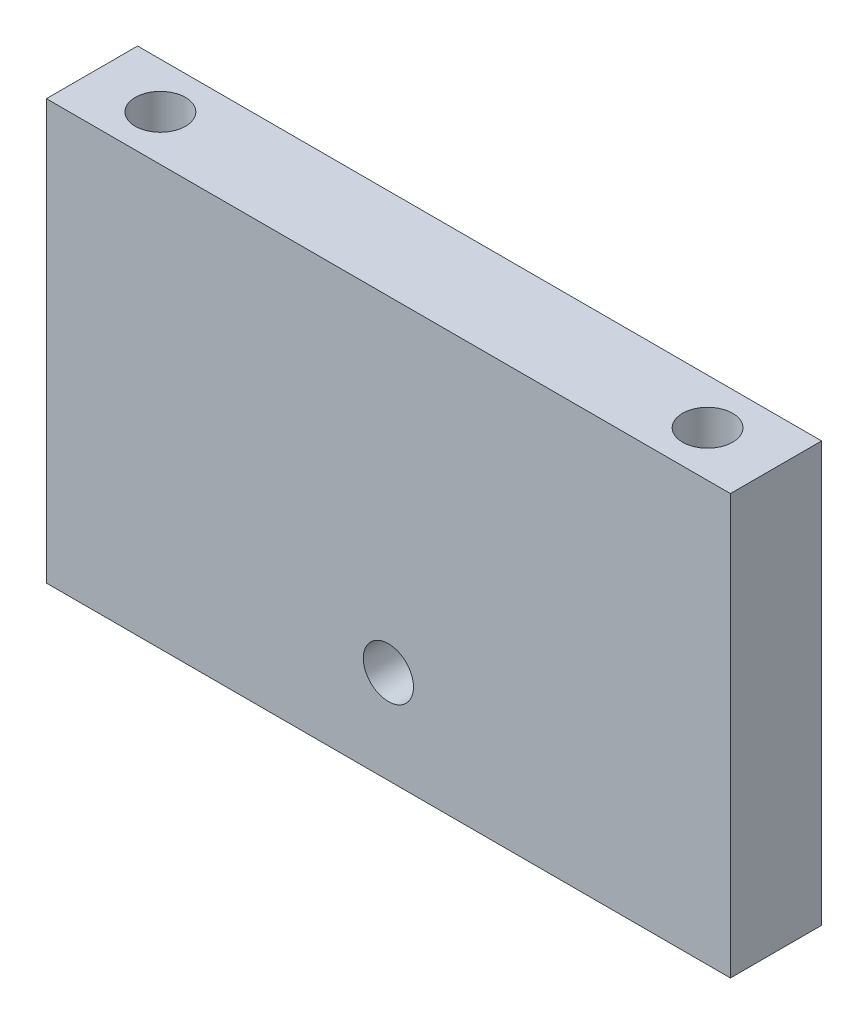
ISO-10303-21;
HEADER;
FILE_DESCRIPTION(('STEP AP214'),'2;1');
FILE_NAME('part.step','',(''),(''),'','','');
FILE_SCHEMA(('AUTOMOTIVE_DESIGN { 1 0 10303 214 1 1 1 1 }'));
ENDSEC;
DATA;
#1=APPLICATION_CONTEXT('core data for automotive mechanical design processes');
#2=APPLICATION_PROTOCOL_DEFINITION('international standard','automotive_design',2000,#1);
#3=PRODUCT_CONTEXT('',#1,'mechanical');
#4=PRODUCT('Part','Part','',(#3));
#5=PRODUCT_RELATED_PRODUCT_CATEGORY('part','',(#4));
#6=PRODUCT_DEFINITION_FORMATION('','',#4);
#7=PRODUCT_DEFINITION_CONTEXT('part definition',#1,'design');
#8=PRODUCT_DEFINITION('design','',#6,#7);
#9=PRODUCT_DEFINITION_SHAPE('','',#8);
#10=(LENGTH_UNIT() NAMED_UNIT(*) SI_UNIT(.MILLI.,.METRE.));
#11=(NAMED_UNIT(*) PLANE_ANGLE_UNIT() SI_UNIT($,.RADIAN.));
#12=(NAMED_UNIT(*) SI_UNIT($,.STERADIAN.) SOLID_ANGLE_UNIT());
#13=UNCERTAINTY_MEASURE_WITH_UNIT(LENGTH_MEASURE(1.E-05),#10,'distance_accuracy_value','');
#14=(GEOMETRIC_REPRESENTATION_CONTEXT(3) GLOBAL_UNCERTAINTY_ASSIGNED_CONTEXT((#13)) GLOBAL_UNIT_ASSIGNED_CONTEXT((#10,
#11,#12)) REPRESENTATION_CONTEXT('',''));
#15=CARTESIAN_POINT('',(0.,0.,0.));
#16=DIRECTION('',(0.,0.,1.));
#17=DIRECTION('',(1.,0.,0.));
#18=AXIS2_PLACEMENT_3D('',#15,#16,#17);
#19=CARTESIAN_POINT('',(0.,46.,0.));
#20=DIRECTION('',(0.,-1.,0.));
#21=DIRECTION('',(0.,0.,-1.));
#22=AXIS2_PLACEMENT_3D('',#19,#20,#21);
#23=PLANE('',#22);
#24=DIRECTION('',(0.,0.,1.));
#25=VECTOR('',#24,1.);
#26=CARTESIAN_POINT('',(0.,46.,0.));
#27=LINE('',#26,#25);
#28=CARTESIAN_POINT('',(0.,46.,-10.));
#29=VERTEX_POINT('',#28);
#30=CARTESIAN_POINT('',(0.,46.,0.));
#31=VERTEX_POINT('',#30);
#32=EDGE_CURVE('E99',#29,#31,#27,.T.);
#33=ORIENTED_EDGE('',*,*,#32,.T.);
#34=DIRECTION('',(1.,0.,0.));
#35=VECTOR('',#34,1.);
#36=CARTESIAN_POINT('',(0.,46.,0.));
#37=LINE('',#36,#35);
#38=CARTESIAN_POINT('',(75.,46.,0.));
#39=VERTEX_POINT('',#38);
#40=EDGE_CURVE('E94',#31,#39,#37,.T.);
#41=ORIENTED_EDGE('',*,*,#40,.T.);
#42=DIRECTION('',(0.,0.,-1.));
#43=VECTOR('',#42,1.);
#44=CARTESIAN_POINT('',(75.,46.,0.));
#45=LINE('',#44,#43);
#46=CARTESIAN_POINT('',(75.,46.,-10.));
#47=VERTEX_POINT('',#46);
#48=EDGE_CURVE('E97',#39,#47,#45,.T.);
#49=ORIENTED_EDGE('',*,*,#48,.T.);
#50=DIRECTION('',(-1.,0.,0.));
#51=VECTOR('',#50,1.);
#52=CARTESIAN_POINT('',(0.,46.,-10.));
#53=LINE('',#52,#51);
#54=EDGE_CURVE('E64',#47,#29,#53,.T.);
#55=ORIENTED_EDGE('',*,*,#54,.T.);
#56=EDGE_LOOP('',(#33,#41,#49,#55));
#57=FACE_BOUND('',#56,.T.);
#58=CARTESIAN_POINT('',(7.5,46.,-5.));
#59=DIRECTION('',(0.,1.,0.));
#60=DIRECTION('',(0.,0.,1.));
#61=AXIS2_PLACEMENT_3D('',#58,#59,#60);
#62=CIRCLE('',#61,2.75);
#63=CARTESIAN_POINT('',(7.5,46.,-2.25));
#64=VERTEX_POINT('',#63);
#65=EDGE_CURVE('E120',#64,#64,#62,.T.);
#66=ORIENTED_EDGE('',*,*,#65,.F.);
#67=EDGE_LOOP('',(#66));
#68=FACE_BOUND('',#67,.T.);
#69=CARTESIAN_POINT('',(67.5,46.,-5.));
#70=DIRECTION('',(0.,1.,0.));
#71=DIRECTION('',(0.,0.,-1.));
#72=AXIS2_PLACEMENT_3D('',#69,#70,#71);
#73=CIRCLE('',#72,2.75000000000001);
#74=CARTESIAN_POINT('',(67.5,46.,-7.75000000000001));
#75=VERTEX_POINT('',#74);
#76=EDGE_CURVE('E142',#75,#75,#73,.T.);
#77=ORIENTED_EDGE('',*,*,#76,.F.);
#78=EDGE_LOOP('',(#77));
#79=FACE_BOUND('',#78,.T.);
#80=ADVANCED_FACE('F45',(#57,#68,#79),#23,.F.);
#81=CARTESIAN_POINT('',(0.,0.,0.));
#82=DIRECTION('',(0.,-1.,0.));
#83=DIRECTION('',(0.,0.,-1.));
#84=AXIS2_PLACEMENT_3D('',#81,#82,#83);
#85=PLANE('',#84);
#86=CARTESIAN_POINT('',(7.5,0.,-5.));
#87=DIRECTION('',(0.,1.,0.));
#88=DIRECTION('',(0.,0.,1.));
#89=AXIS2_PLACEMENT_3D('',#86,#87,#88);
#90=CIRCLE('',#89,2.75);
#91=CARTESIAN_POINT('',(7.5,0.,-2.25));
#92=VERTEX_POINT('',#91);
#93=EDGE_CURVE('E138',#92,#92,#90,.T.);
#94=ORIENTED_EDGE('',*,*,#93,.T.);
#95=EDGE_LOOP('',(#94));
#96=FACE_BOUND('',#95,.T.);
#97=DIRECTION('',(0.,0.,1.));
#98=VECTOR('',#97,1.);
#99=CARTESIAN_POINT('',(0.,0.,0.));
#100=LINE('',#99,#98);
#101=CARTESIAN_POINT('',(0.,0.,-10.));
#102=VERTEX_POINT('',#101);
#103=CARTESIAN_POINT('',(0.,0.,0.));
#104=VERTEX_POINT('',#103);
#105=EDGE_CURVE('E116',#102,#104,#100,.T.);
#106=ORIENTED_EDGE('',*,*,#105,.F.);
#107=DIRECTION('',(-1.,0.,0.));
#108=VECTOR('',#107,1.);
#109=CARTESIAN_POINT('',(0.,0.,-10.));
#110=LINE('',#109,#108);
#111=CARTESIAN_POINT('',(75.,0.,-10.));
#112=VERTEX_POINT('',#111);
#113=EDGE_CURVE('E87',#112,#102,#110,.T.);
#114=ORIENTED_EDGE('',*,*,#113,.F.);
#115=DIRECTION('',(0.,0.,-1.));
#116=VECTOR('',#115,1.);
#117=CARTESIAN_POINT('',(75.,0.,0.));
#118=LINE('',#117,#116);
#119=CARTESIAN_POINT('',(75.,0.,0.));
#120=VERTEX_POINT('',#119);
#121=EDGE_CURVE('E81',#120,#112,#118,.T.);
#122=ORIENTED_EDGE('',*,*,#121,.F.);
#123=DIRECTION('',(1.,0.,0.));
#124=VECTOR('',#123,1.);
#125=CARTESIAN_POINT('',(0.,0.,0.));
#126=LINE('',#125,#124);
#127=EDGE_CURVE('E104',#104,#120,#126,.T.);
#128=ORIENTED_EDGE('',*,*,#127,.F.);
#129=EDGE_LOOP('',(#106,#114,#122,#128));
#130=FACE_BOUND('',#129,.T.);
#131=CARTESIAN_POINT('',(67.5,0.,-5.));
#132=DIRECTION('',(0.,1.,0.));
#133=DIRECTION('',(0.,0.,-1.));
#134=AXIS2_PLACEMENT_3D('',#131,#132,#133);
#135=CIRCLE('',#134,2.75000000000001);
#136=CARTESIAN_POINT('',(67.5,0.,-7.75000000000001));
#137=VERTEX_POINT('',#136);
#138=EDGE_CURVE('E146',#137,#137,#135,.T.);
#139=ORIENTED_EDGE('',*,*,#138,.T.);
#140=EDGE_LOOP('',(#139));
#141=FACE_BOUND('',#140,.T.);
#142=ADVANCED_FACE('F133',(#96,#130,#141),#85,.T.);
#143=CARTESIAN_POINT('',(0.,46.,0.));
#144=DIRECTION('',(1.,0.,0.));
#145=DIRECTION('',(0.,0.,-1.));
#146=AXIS2_PLACEMENT_3D('',#143,#144,#145);
#147=PLANE('',#146);
#148=ORIENTED_EDGE('',*,*,#105,.T.);
#149=DIRECTION('',(0.,-1.,0.));
#150=VECTOR('',#149,1.);
#151=CARTESIAN_POINT('',(0.,46.,0.));
#152=LINE('',#151,#150);
#153=EDGE_CURVE('E11',#31,#104,#152,.T.);
#154=ORIENTED_EDGE('',*,*,#153,.F.);
#155=ORIENTED_EDGE('',*,*,#32,.F.);
#156=DIRECTION('',(0.,-1.,0.));
#157=VECTOR('',#156,1.);
#158=CARTESIAN_POINT('',(0.,46.,-10.));
#159=LINE('',#158,#157);
#160=EDGE_CURVE('E112',#29,#102,#159,.T.);
#161=ORIENTED_EDGE('',*,*,#160,.T.);
#162=EDGE_LOOP('',(#148,#154,#155,#161));
#163=FACE_BOUND('',#162,.T.);
#164=ADVANCED_FACE('F47',(#163),#147,.F.);
#165=CARTESIAN_POINT('',(0.,46.,0.));
#166=DIRECTION('',(0.,0.,-1.));
#167=DIRECTION('',(-1.,0.,0.));
#168=AXIS2_PLACEMENT_3D('',#165,#166,#167);
#169=PLANE('',#168);
#170=CARTESIAN_POINT('',(37.5,10.25,0.));
#171=DIRECTION('',(0.,0.,1.));
#172=DIRECTION('',(1.,0.,0.));
#173=AXIS2_PLACEMENT_3D('',#170,#171,#172);
#174=CIRCLE('',#173,2.75);
#175=CARTESIAN_POINT('',(40.25,10.25,0.));
#176=VERTEX_POINT('',#175);
#177=EDGE_CURVE('E153',#176,#176,#174,.T.);
#178=ORIENTED_EDGE('',*,*,#177,.F.);
#179=EDGE_LOOP('',(#178));
#180=FACE_BOUND('',#179,.T.);
#181=ORIENTED_EDGE('',*,*,#127,.T.);
#182=DIRECTION('',(0.,-1.,0.));
#183=VECTOR('',#182,1.);
#184=CARTESIAN_POINT('',(75.,46.,0.));
#185=LINE('',#184,#183);
#186=EDGE_CURVE('E56',#39,#120,#185,.T.);
#187=ORIENTED_EDGE('',*,*,#186,.F.);
#188=ORIENTED_EDGE('',*,*,#40,.F.);
#189=ORIENTED_EDGE('',*,*,#153,.T.);
#190=EDGE_LOOP('',(#181,#187,#188,#189));
#191=FACE_BOUND('',#190,.T.);
#192=ADVANCED_FACE('F103',(#180,#191),#169,.F.);
#193=CARTESIAN_POINT('',(75.,46.,0.));
#194=DIRECTION('',(-1.,0.,0.));
#195=DIRECTION('',(0.,0.,1.));
#196=AXIS2_PLACEMENT_3D('',#193,#194,#195);
#197=PLANE('',#196);
#198=ORIENTED_EDGE('',*,*,#121,.T.);
#199=DIRECTION('',(0.,-1.,0.));
#200=VECTOR('',#199,1.);
#201=CARTESIAN_POINT('',(75.,46.,-10.));
#202=LINE('',#201,#200);
#203=EDGE_CURVE('E106',#47,#112,#202,.T.);
#204=ORIENTED_EDGE('',*,*,#203,.F.);
#205=ORIENTED_EDGE('',*,*,#48,.F.);
#206=ORIENTED_EDGE('',*,*,#186,.T.);
#207=EDGE_LOOP('',(#198,#204,#205,#206));
#208=FACE_BOUND('',#207,.T.);
#209=ADVANCED_FACE('F108',(#208),#197,.F.);
#210=CARTESIAN_POINT('',(0.,46.,-10.));
#211=DIRECTION('',(0.,0.,1.));
#212=DIRECTION('',(1.,0.,0.));
#213=AXIS2_PLACEMENT_3D('',#210,#211,#212);
#214=PLANE('',#213);
#215=CARTESIAN_POINT('',(37.5,10.25,-10.));
#216=DIRECTION('',(0.,0.,1.));
#217=DIRECTION('',(1.,0.,0.));
#218=AXIS2_PLACEMENT_3D('',#215,#216,#217);
#219=CIRCLE('',#218,2.75);
#220=CARTESIAN_POINT('',(40.25,10.25,-10.));
#221=VERTEX_POINT('',#220);
#222=EDGE_CURVE('E49',#221,#221,#219,.T.);
#223=ORIENTED_EDGE('',*,*,#222,.T.);
#224=EDGE_LOOP('',(#223));
#225=FACE_BOUND('',#224,.T.);
#226=ORIENTED_EDGE('',*,*,#113,.T.);
#227=ORIENTED_EDGE('',*,*,#160,.F.);
#228=ORIENTED_EDGE('',*,*,#54,.F.);
#229=ORIENTED_EDGE('',*,*,#203,.T.);
#230=EDGE_LOOP('',(#226,#227,#228,#229));
#231=FACE_BOUND('',#230,.T.);
#232=ADVANCED_FACE('F130',(#225,#231),#214,.F.);
#233=CARTESIAN_POINT('',(7.5,46.,-5.));
#234=DIRECTION('',(0.,-1.,0.));
#235=DIRECTION('',(0.,0.,-1.));
#236=AXIS2_PLACEMENT_3D('',#233,#234,#235);
#237=CYLINDRICAL_SURFACE('',#236,2.75);
#238=ORIENTED_EDGE('',*,*,#65,.T.);
#239=EDGE_LOOP('',(#238));
#240=FACE_BOUND('',#239,.T.);
#241=ORIENTED_EDGE('',*,*,#93,.F.);
#242=EDGE_LOOP('',(#241));
#243=FACE_BOUND('',#242,.T.);
#244=ADVANCED_FACE('F171',(#240,#243),#237,.F.);
#245=CARTESIAN_POINT('',(67.5,46.,-5.));
#246=DIRECTION('',(0.,-1.,0.));
#247=DIRECTION('',(0.,0.,-1.));
#248=AXIS2_PLACEMENT_3D('',#245,#246,#247);
#249=CYLINDRICAL_SURFACE('',#248,2.75000000000001);
#250=ORIENTED_EDGE('',*,*,#76,.T.);
#251=EDGE_LOOP('',(#250));
#252=FACE_BOUND('',#251,.T.);
#253=ORIENTED_EDGE('',*,*,#138,.F.);
#254=EDGE_LOOP('',(#253));
#255=FACE_BOUND('',#254,.T.);
#256=ADVANCED_FACE('F165',(#252,#255),#249,.F.);
#257=CARTESIAN_POINT('',(37.5,10.25,-45.));
#258=DIRECTION('',(0.,0.,1.));
#259=DIRECTION('',(1.,0.,0.));
#260=AXIS2_PLACEMENT_3D('',#257,#258,#259);
#261=CYLINDRICAL_SURFACE('',#260,2.75);
#262=CARTESIAN_POINT('',(40.25,10.25,0.));
#263=CARTESIAN_POINT('',(40.25,10.25,-0.104166666666674));
#264=CARTESIAN_POINT('',(40.25,10.25,-0.20833333333334));
#265=CARTESIAN_POINT('',(40.25,10.25,-0.416666666666674));
#266=CARTESIAN_POINT('',(40.25,10.25,-0.520833333333341));
#267=CARTESIAN_POINT('',(40.25,10.25,-0.729166666666674));
#268=CARTESIAN_POINT('',(40.25,10.25,-0.833333333333341));
#269=CARTESIAN_POINT('',(40.25,10.25,-1.04166666666667));
#270=CARTESIAN_POINT('',(40.25,10.25,-1.14583333333334));
#271=CARTESIAN_POINT('',(40.25,10.25,-1.35416666666667));
#272=CARTESIAN_POINT('',(40.25,10.25,-1.45833333333334));
#273=CARTESIAN_POINT('',(40.25,10.25,-1.66666666666667));
#274=CARTESIAN_POINT('',(40.25,10.25,-1.77083333333334));
#275=CARTESIAN_POINT('',(40.25,10.25,-1.97916666666668));
#276=CARTESIAN_POINT('',(40.25,10.25,-2.08333333333334));
#277=CARTESIAN_POINT('',(40.25,10.25,-2.29166666666668));
#278=CARTESIAN_POINT('',(40.25,10.25,-2.39583333333334));
#279=CARTESIAN_POINT('',(40.25,10.25,-2.60416666666667));
#280=CARTESIAN_POINT('',(40.25,10.25,-2.70833333333334));
#281=CARTESIAN_POINT('',(40.25,10.25,-2.91666666666667));
#282=CARTESIAN_POINT('',(40.25,10.25,-3.02083333333334));
#283=CARTESIAN_POINT('',(40.25,10.25,-3.22916666666667));
#284=CARTESIAN_POINT('',(40.25,10.25,-3.33333333333334));
#285=CARTESIAN_POINT('',(40.25,10.25,-3.54166666666667));
#286=CARTESIAN_POINT('',(40.25,10.25,-3.64583333333334));
#287=CARTESIAN_POINT('',(40.25,10.25,-3.85416666666667));
#288=CARTESIAN_POINT('',(40.25,10.25,-3.95833333333334));
#289=CARTESIAN_POINT('',(40.25,10.25,-4.16666666666667));
#290=CARTESIAN_POINT('',(40.25,10.25,-4.27083333333334));
#291=CARTESIAN_POINT('',(40.25,10.25,-4.47916666666667));
#292=CARTESIAN_POINT('',(40.25,10.25,-4.58333333333334));
#293=CARTESIAN_POINT('',(40.25,10.25,-4.79166666666667));
#294=CARTESIAN_POINT('',(40.25,10.25,-4.89583333333334));
#295=CARTESIAN_POINT('',(40.25,10.25,-5.10416666666667));
#296=CARTESIAN_POINT('',(40.25,10.25,-5.20833333333334));
#297=CARTESIAN_POINT('',(40.25,10.25,-5.41666666666667));
#298=CARTESIAN_POINT('',(40.25,10.25,-5.52083333333334));
#299=CARTESIAN_POINT('',(40.25,10.25,-5.72916666666667));
#300=CARTESIAN_POINT('',(40.25,10.25,-5.83333333333334));
#301=CARTESIAN_POINT('',(40.25,10.25,-6.04166666666667));
#302=CARTESIAN_POINT('',(40.25,10.25,-6.14583333333334));
#303=CARTESIAN_POINT('',(40.25,10.25,-6.35416666666667));
#304=CARTESIAN_POINT('',(40.25,10.25,-6.45833333333334));
#305=CARTESIAN_POINT('',(40.25,10.25,-6.66666666666667));
#306=CARTESIAN_POINT('',(40.25,10.25,-6.77083333333334));
#307=CARTESIAN_POINT('',(40.25,10.25,-6.97916666666667));
#308=CARTESIAN_POINT('',(40.25,10.25,-7.08333333333334));
#309=CARTESIAN_POINT('',(40.25,10.25,-7.29166666666667));
#310=CARTESIAN_POINT('',(40.25,10.25,-7.39583333333333));
#311=CARTESIAN_POINT('',(40.25,10.25,-7.60416666666667));
#312=CARTESIAN_POINT('',(40.25,10.25,-7.70833333333334));
#313=CARTESIAN_POINT('',(40.25,10.25,-7.91666666666667));
#314=CARTESIAN_POINT('',(40.25,10.25,-8.02083333333334));
#315=CARTESIAN_POINT('',(40.25,10.25,-8.22916666666667));
#316=CARTESIAN_POINT('',(40.25,10.25,-8.33333333333333));
#317=CARTESIAN_POINT('',(40.25,10.25,-8.54166666666667));
#318=CARTESIAN_POINT('',(40.25,10.25,-8.64583333333333));
#319=CARTESIAN_POINT('',(40.25,10.25,-8.85416666666667));
#320=CARTESIAN_POINT('',(40.25,10.25,-8.95833333333333));
#321=CARTESIAN_POINT('',(40.25,10.25,-9.16666666666667));
#322=CARTESIAN_POINT('',(40.25,10.25,-9.27083333333333));
#323=CARTESIAN_POINT('',(40.25,10.25,-9.47916666666667));
#324=CARTESIAN_POINT('',(40.25,10.25,-9.58333333333333));
#325=CARTESIAN_POINT('',(40.25,10.25,-9.79166666666667));
#326=CARTESIAN_POINT('',(40.25,10.25,-9.89583333333333));
#327=CARTESIAN_POINT('',(40.25,10.25,-10.));
#328=B_SPLINE_CURVE_WITH_KNOTS('',3,(#262,#263,#264,#265,#266,#267,#268,#269,#270,#271,#272,
#273,#274,#275,#276,#277,#278,#279,#280,#281,#282,#283,#284,#285,#286,#287,#288,#289,#290,#291,
#292,#293,#294,#295,#296,#297,#298,#299,#300,#301,#302,#303,#304,#305,#306,#307,#308,#309,#310,
#311,#312,#313,#314,#315,#316,#317,#318,#319,#320,#321,#322,#323,#324,#325,#326,#327),
.UNSPECIFIED.,.F.,.F.,(4,2,2,2,2,2,2,2,2,2,2,2,2,2,2,2,2,2,2,2,2,2,2,2,2,2,2,2,2,2,2,2,4),(0.,
0.3125,0.625000000000001,0.937500000000001,1.25,1.5625,1.875,2.1875,2.5,2.8125,3.125,3.4375,
3.75,4.0625,4.375,4.6875,5.,5.3125,5.625,5.9375,6.25,6.5625,6.875,7.1875,7.49999999999999,
7.8125,8.12499999999999,8.43749999999999,8.74999999999999,9.06249999999999,9.37499999999999,
9.68749999999999,9.99999999999999),.UNSPECIFIED.);
#329=EDGE_CURVE('BSEAM163',#176,#221,#328,.T.);
#330=ORIENTED_EDGE('',*,*,#177,.T.);
#331=ORIENTED_EDGE('',*,*,#222,.F.);
#332=ORIENTED_EDGE('',*,*,#329,.T.);
#333=ORIENTED_EDGE('',*,*,#329,.F.);
#334=EDGE_LOOP('',(#330,#332,#331,#333));
#335=FACE_BOUND('',#334,.T.);
#336=ADVANCED_FACE('F163',(#335),#261,.F.);
#337=CLOSED_SHELL('',(#80,#142,#164,#192,#209,#232,#244,#256,#336));
#338=MANIFOLD_SOLID_BREP('B2',#337);
#339=ADVANCED_BREP_SHAPE_REPRESENTATION('',(#18,#338),#14);
#340=SHAPE_DEFINITION_REPRESENTATION(#9,#339);
ENDSEC;
END-ISO-10303-21;
